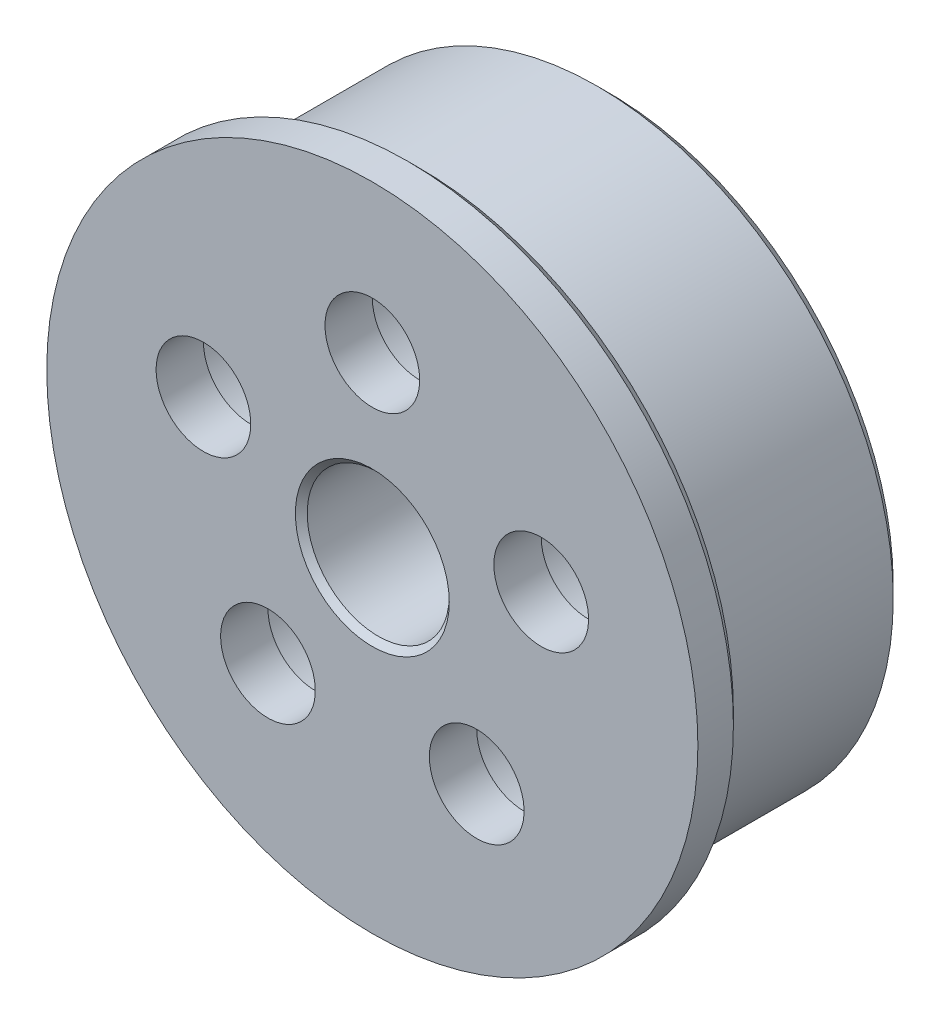
ISO-10303-21;
HEADER;
FILE_DESCRIPTION(('STEP AP214'),'2;1');
FILE_NAME('part.step','',(''),(''),'','','');
FILE_SCHEMA(('AUTOMOTIVE_DESIGN { 1 0 10303 214 1 1 1 1 }'));
ENDSEC;
DATA;
#1=APPLICATION_CONTEXT('core data for automotive mechanical design processes');
#2=APPLICATION_PROTOCOL_DEFINITION('international standard','automotive_design',2000,#1);
#3=PRODUCT_CONTEXT('',#1,'mechanical');
#4=PRODUCT('Part','Part','',(#3));
#5=PRODUCT_RELATED_PRODUCT_CATEGORY('part','',(#4));
#6=PRODUCT_DEFINITION_FORMATION('','',#4);
#7=PRODUCT_DEFINITION_CONTEXT('part definition',#1,'design');
#8=PRODUCT_DEFINITION('design','',#6,#7);
#9=PRODUCT_DEFINITION_SHAPE('','',#8);
#10=(LENGTH_UNIT() NAMED_UNIT(*) SI_UNIT(.MILLI.,.METRE.));
#11=(NAMED_UNIT(*) PLANE_ANGLE_UNIT() SI_UNIT($,.RADIAN.));
#12=(NAMED_UNIT(*) SI_UNIT($,.STERADIAN.) SOLID_ANGLE_UNIT());
#13=UNCERTAINTY_MEASURE_WITH_UNIT(LENGTH_MEASURE(1.E-05),#10,'distance_accuracy_value','');
#14=(GEOMETRIC_REPRESENTATION_CONTEXT(3) GLOBAL_UNCERTAINTY_ASSIGNED_CONTEXT((#13)) GLOBAL_UNIT_ASSIGNED_CONTEXT((#10,
#11,#12)) REPRESENTATION_CONTEXT('',''));
#15=CARTESIAN_POINT('',(0.,0.,0.));
#16=DIRECTION('',(0.,0.,1.));
#17=DIRECTION('',(1.,0.,0.));
#18=AXIS2_PLACEMENT_3D('',#15,#16,#17);
#19=CARTESIAN_POINT('',(0.,0.,10.));
#20=DIRECTION('',(0.,0.,-1.));
#21=DIRECTION('',(-1.,0.,0.));
#22=AXIS2_PLACEMENT_3D('',#19,#20,#21);
#23=CYLINDRICAL_SURFACE('',#22,12.5);
#24=CARTESIAN_POINT('',(0.,0.,0.500000000000002));
#25=DIRECTION('',(0.,0.,1.));
#26=DIRECTION('',(1.,0.,0.));
#27=AXIS2_PLACEMENT_3D('',#24,#25,#26);
#28=CIRCLE('',#27,12.5);
#29=CARTESIAN_POINT('',(12.5,0.,0.500000000000002));
#30=VERTEX_POINT('',#29);
#31=EDGE_CURVE('E100',#30,#30,#28,.T.);
#32=ORIENTED_EDGE('',*,*,#31,.T.);
#33=EDGE_LOOP('',(#32));
#34=FACE_BOUND('',#33,.T.);
#35=CARTESIAN_POINT('',(0.,0.,8.));
#36=DIRECTION('',(0.,0.,1.));
#37=DIRECTION('',(1.,0.,0.));
#38=AXIS2_PLACEMENT_3D('',#35,#36,#37);
#39=CIRCLE('',#38,12.5);
#40=CARTESIAN_POINT('',(12.5,0.,8.));
#41=VERTEX_POINT('',#40);
#42=EDGE_CURVE('E103',#41,#41,#39,.T.);
#43=ORIENTED_EDGE('',*,*,#42,.F.);
#44=EDGE_LOOP('',(#43));
#45=FACE_BOUND('',#44,.T.);
#46=ADVANCED_FACE('F40',(#34,#45),#23,.T.);
#47=CARTESIAN_POINT('',(0.,0.,10.));
#48=DIRECTION('',(0.,0.,1.));
#49=DIRECTION('',(1.,0.,0.));
#50=AXIS2_PLACEMENT_3D('',#47,#48,#49);
#51=PLANE('',#50);
#52=CARTESIAN_POINT('',(0.,0.,10.));
#53=DIRECTION('',(0.,0.,1.));
#54=DIRECTION('',(1.,0.,0.));
#55=AXIS2_PLACEMENT_3D('',#52,#53,#54);
#56=CIRCLE('',#55,3.25);
#57=CARTESIAN_POINT('',(3.25,0.,10.));
#58=VERTEX_POINT('',#57);
#59=EDGE_CURVE('E64',#58,#58,#56,.F.);
#60=ORIENTED_EDGE('',*,*,#59,.T.);
#61=EDGE_LOOP('',(#60));
#62=FACE_BOUND('',#61,.T.);
#63=CARTESIAN_POINT('',(0.,7.5,10.));
#64=DIRECTION('',(0.,0.,-1.));
#65=DIRECTION('',(-1.,0.,0.));
#66=AXIS2_PLACEMENT_3D('',#63,#64,#65);
#67=CIRCLE('',#66,2.);
#68=CARTESIAN_POINT('',(-2.,7.5,10.));
#69=VERTEX_POINT('',#68);
#70=EDGE_CURVE('E145',#69,#69,#67,.T.);
#71=ORIENTED_EDGE('',*,*,#70,.T.);
#72=EDGE_LOOP('',(#71));
#73=FACE_BOUND('',#72,.T.);
#74=CARTESIAN_POINT('',(-7.13292387221365,2.3176274578121,10.));
#75=DIRECTION('',(0.,0.,-1.));
#76=DIRECTION('',(-1.,0.,0.));
#77=AXIS2_PLACEMENT_3D('',#74,#75,#76);
#78=CIRCLE('',#77,2.);
#79=CARTESIAN_POINT('',(-9.13292387221365,2.3176274578121,10.));
#80=VERTEX_POINT('',#79);
#81=EDGE_CURVE('E136',#80,#80,#78,.T.);
#82=ORIENTED_EDGE('',*,*,#81,.T.);
#83=EDGE_LOOP('',(#82));
#84=FACE_BOUND('',#83,.T.);
#85=CARTESIAN_POINT('',(-4.40838939219355,-6.06762745781211,10.));
#86=DIRECTION('',(0.,0.,-1.));
#87=DIRECTION('',(-1.,0.,0.));
#88=AXIS2_PLACEMENT_3D('',#85,#86,#87);
#89=CIRCLE('',#88,2.);
#90=CARTESIAN_POINT('',(-6.40838939219355,-6.06762745781211,10.));
#91=VERTEX_POINT('',#90);
#92=EDGE_CURVE('E127',#91,#91,#89,.T.);
#93=ORIENTED_EDGE('',*,*,#92,.T.);
#94=EDGE_LOOP('',(#93));
#95=FACE_BOUND('',#94,.T.);
#96=CARTESIAN_POINT('',(4.40838939219355,-6.0676274578121,10.));
#97=DIRECTION('',(0.,0.,-1.));
#98=DIRECTION('',(-1.,0.,0.));
#99=AXIS2_PLACEMENT_3D('',#96,#97,#98);
#100=CIRCLE('',#99,2.);
#101=CARTESIAN_POINT('',(2.40838939219355,-6.0676274578121,10.));
#102=VERTEX_POINT('',#101);
#103=EDGE_CURVE('E118',#102,#102,#100,.T.);
#104=ORIENTED_EDGE('',*,*,#103,.T.);
#105=EDGE_LOOP('',(#104));
#106=FACE_BOUND('',#105,.T.);
#107=CARTESIAN_POINT('',(7.13292387221365,2.31762745781211,10.));
#108=DIRECTION('',(0.,0.,-1.));
#109=DIRECTION('',(-1.,0.,0.));
#110=AXIS2_PLACEMENT_3D('',#107,#108,#109);
#111=CIRCLE('',#110,2.);
#112=CARTESIAN_POINT('',(5.13292387221365,2.31762745781211,10.));
#113=VERTEX_POINT('',#112);
#114=EDGE_CURVE('E109',#113,#113,#111,.T.);
#115=ORIENTED_EDGE('',*,*,#114,.T.);
#116=EDGE_LOOP('',(#115));
#117=FACE_BOUND('',#116,.T.);
#118=CARTESIAN_POINT('',(0.,0.,10.));
#119=DIRECTION('',(0.,0.,1.));
#120=DIRECTION('',(1.,0.,0.));
#121=AXIS2_PLACEMENT_3D('',#118,#119,#120);
#122=CIRCLE('',#121,13.75);
#123=CARTESIAN_POINT('',(13.75,0.,10.));
#124=VERTEX_POINT('',#123);
#125=EDGE_CURVE('E106',#124,#124,#122,.T.);
#126=ORIENTED_EDGE('',*,*,#125,.T.);
#127=EDGE_LOOP('',(#126));
#128=FACE_BOUND('',#127,.T.);
#129=ADVANCED_FACE('F172',(#62,#73,#84,#95,#106,#117,#128),#51,.T.);
#130=CARTESIAN_POINT('',(0.,0.,0.));
#131=DIRECTION('',(0.,0.,1.));
#132=DIRECTION('',(1.,0.,0.));
#133=AXIS2_PLACEMENT_3D('',#130,#131,#132);
#134=PLANE('',#133);
#135=CARTESIAN_POINT('',(0.,0.,0.));
#136=DIRECTION('',(0.,0.,1.));
#137=DIRECTION('',(1.,0.,0.));
#138=AXIS2_PLACEMENT_3D('',#135,#136,#137);
#139=CIRCLE('',#138,3.25);
#140=CARTESIAN_POINT('',(3.25,0.,0.));
#141=VERTEX_POINT('',#140);
#142=EDGE_CURVE('E67',#141,#141,#139,.T.);
#143=ORIENTED_EDGE('',*,*,#142,.T.);
#144=EDGE_LOOP('',(#143));
#145=FACE_BOUND('',#144,.T.);
#146=CARTESIAN_POINT('',(4.40838939219355,-6.0676274578121,0.));
#147=DIRECTION('',(0.,0.,1.));
#148=DIRECTION('',(1.,0.,0.));
#149=AXIS2_PLACEMENT_3D('',#146,#147,#148);
#150=CIRCLE('',#149,3.75);
#151=CARTESIAN_POINT('',(8.15838939219355,-6.0676274578121,0.));
#152=VERTEX_POINT('',#151);
#153=EDGE_CURVE('E70',#152,#152,#150,.T.);
#154=ORIENTED_EDGE('',*,*,#153,.T.);
#155=EDGE_LOOP('',(#154));
#156=FACE_BOUND('',#155,.T.);
#157=CARTESIAN_POINT('',(-4.40838939219355,-6.06762745781211,0.));
#158=DIRECTION('',(0.,0.,1.));
#159=DIRECTION('',(1.,0.,0.));
#160=AXIS2_PLACEMENT_3D('',#157,#158,#159);
#161=CIRCLE('',#160,3.75);
#162=CARTESIAN_POINT('',(-0.658389392193544,-6.06762745781211,0.));
#163=VERTEX_POINT('',#162);
#164=EDGE_CURVE('E73',#163,#163,#161,.T.);
#165=ORIENTED_EDGE('',*,*,#164,.T.);
#166=EDGE_LOOP('',(#165));
#167=FACE_BOUND('',#166,.T.);
#168=CARTESIAN_POINT('',(-7.13292387221365,2.3176274578121,0.));
#169=DIRECTION('',(0.,0.,1.));
#170=DIRECTION('',(1.,0.,0.));
#171=AXIS2_PLACEMENT_3D('',#168,#169,#170);
#172=CIRCLE('',#171,3.75);
#173=CARTESIAN_POINT('',(-3.38292387221365,2.3176274578121,0.));
#174=VERTEX_POINT('',#173);
#175=EDGE_CURVE('E76',#174,#174,#172,.T.);
#176=ORIENTED_EDGE('',*,*,#175,.T.);
#177=EDGE_LOOP('',(#176));
#178=FACE_BOUND('',#177,.T.);
#179=CARTESIAN_POINT('',(0.,7.5,0.));
#180=DIRECTION('',(0.,0.,1.));
#181=DIRECTION('',(1.,0.,0.));
#182=AXIS2_PLACEMENT_3D('',#179,#180,#181);
#183=CIRCLE('',#182,3.75);
#184=CARTESIAN_POINT('',(3.75,7.5,0.));
#185=VERTEX_POINT('',#184);
#186=EDGE_CURVE('E79',#185,#185,#183,.T.);
#187=ORIENTED_EDGE('',*,*,#186,.T.);
#188=EDGE_LOOP('',(#187));
#189=FACE_BOUND('',#188,.T.);
#190=CARTESIAN_POINT('',(7.13292387221365,2.31762745781211,0.));
#191=DIRECTION('',(0.,0.,1.));
#192=DIRECTION('',(1.,0.,0.));
#193=AXIS2_PLACEMENT_3D('',#190,#191,#192);
#194=CIRCLE('',#193,3.75);
#195=CARTESIAN_POINT('',(10.8829238722137,2.31762745781211,0.));
#196=VERTEX_POINT('',#195);
#197=EDGE_CURVE('E82',#196,#196,#194,.T.);
#198=ORIENTED_EDGE('',*,*,#197,.T.);
#199=EDGE_LOOP('',(#198));
#200=FACE_BOUND('',#199,.T.);
#201=CARTESIAN_POINT('',(0.,0.,0.));
#202=DIRECTION('',(0.,0.,1.));
#203=DIRECTION('',(1.,0.,0.));
#204=AXIS2_PLACEMENT_3D('',#201,#202,#203);
#205=CIRCLE('',#204,12.);
#206=CARTESIAN_POINT('',(12.,0.,0.));
#207=VERTEX_POINT('',#206);
#208=EDGE_CURVE('E97',#207,#207,#205,.F.);
#209=ORIENTED_EDGE('',*,*,#208,.T.);
#210=EDGE_LOOP('',(#209));
#211=FACE_BOUND('',#210,.T.);
#212=ADVANCED_FACE('F178',(#145,#156,#167,#178,#189,#200,#211),#134,.F.);
#213=CARTESIAN_POINT('',(0.,0.,8.));
#214=DIRECTION('',(0.,0.,1.));
#215=DIRECTION('',(1.,0.,0.));
#216=AXIS2_PLACEMENT_3D('',#213,#214,#215);
#217=CYLINDRICAL_SURFACE('',#216,13.75);
#218=CARTESIAN_POINT('',(0.,0.,8.5));
#219=DIRECTION('',(0.,0.,1.));
#220=DIRECTION('',(1.,0.,0.));
#221=AXIS2_PLACEMENT_3D('',#218,#219,#220);
#222=CIRCLE('',#221,13.75);
#223=CARTESIAN_POINT('',(13.75,0.,8.5));
#224=VERTEX_POINT('',#223);
#225=EDGE_CURVE('E94',#224,#224,#222,.T.);
#226=ORIENTED_EDGE('',*,*,#225,.T.);
#227=EDGE_LOOP('',(#226));
#228=FACE_BOUND('',#227,.T.);
#229=ORIENTED_EDGE('',*,*,#125,.F.);
#230=EDGE_LOOP('',(#229));
#231=FACE_BOUND('',#230,.T.);
#232=ADVANCED_FACE('F242',(#228,#231),#217,.T.);
#233=CARTESIAN_POINT('',(0.,0.,8.));
#234=DIRECTION('',(0.,0.,1.));
#235=DIRECTION('',(1.,0.,0.));
#236=AXIS2_PLACEMENT_3D('',#233,#234,#235);
#237=PLANE('',#236);
#238=CARTESIAN_POINT('',(0.,0.,8.));
#239=DIRECTION('',(0.,0.,1.));
#240=DIRECTION('',(1.,0.,0.));
#241=AXIS2_PLACEMENT_3D('',#238,#239,#240);
#242=CIRCLE('',#241,13.25);
#243=CARTESIAN_POINT('',(13.25,0.,8.));
#244=VERTEX_POINT('',#243);
#245=EDGE_CURVE('E91',#244,#244,#242,.F.);
#246=ORIENTED_EDGE('',*,*,#245,.T.);
#247=EDGE_LOOP('',(#246));
#248=FACE_BOUND('',#247,.T.);
#249=ORIENTED_EDGE('',*,*,#42,.T.);
#250=EDGE_LOOP('',(#249));
#251=FACE_BOUND('',#250,.T.);
#252=ADVANCED_FACE('F253',(#248,#251),#237,.F.);
#253=CARTESIAN_POINT('',(0.,0.,10.));
#254=DIRECTION('',(0.,0.,-1.));
#255=DIRECTION('',(-1.,0.,0.));
#256=AXIS2_PLACEMENT_3D('',#253,#254,#255);
#257=CYLINDRICAL_SURFACE('',#256,3.);
#258=CARTESIAN_POINT('',(0.,0.,0.249999999999995));
#259=DIRECTION('',(0.,0.,1.));
#260=DIRECTION('',(1.,0.,0.));
#261=AXIS2_PLACEMENT_3D('',#258,#259,#260);
#262=CIRCLE('',#261,3.);
#263=CARTESIAN_POINT('',(3.,0.,0.249999999999995));
#264=VERTEX_POINT('',#263);
#265=EDGE_CURVE('E85',#264,#264,#262,.F.);
#266=ORIENTED_EDGE('',*,*,#265,.T.);
#267=EDGE_LOOP('',(#266));
#268=FACE_BOUND('',#267,.T.);
#269=CARTESIAN_POINT('',(0.,0.,9.75));
#270=DIRECTION('',(0.,0.,1.));
#271=DIRECTION('',(1.,0.,0.));
#272=AXIS2_PLACEMENT_3D('',#269,#270,#271);
#273=CIRCLE('',#272,3.);
#274=CARTESIAN_POINT('',(3.,0.,9.75));
#275=VERTEX_POINT('',#274);
#276=EDGE_CURVE('E88',#275,#275,#273,.T.);
#277=ORIENTED_EDGE('',*,*,#276,.T.);
#278=EDGE_LOOP('',(#277));
#279=FACE_BOUND('',#278,.T.);
#280=ADVANCED_FACE('F319',(#268,#279),#257,.F.);
#281=CARTESIAN_POINT('',(7.13292387221365,2.31762745781211,0.));
#282=DIRECTION('',(0.,0.,-1.));
#283=DIRECTION('',(-1.,0.,0.));
#284=AXIS2_PLACEMENT_3D('',#281,#282,#283);
#285=CYLINDRICAL_SURFACE('',#284,2.);
#286=ORIENTED_EDGE('',*,*,#114,.F.);
#287=EDGE_LOOP('',(#286));
#288=FACE_BOUND('',#287,.T.);
#289=CARTESIAN_POINT('',(7.13292387221365,2.31762745781211,8.));
#290=DIRECTION('',(0.,0.,-1.));
#291=DIRECTION('',(-1.,0.,0.));
#292=AXIS2_PLACEMENT_3D('',#289,#290,#291);
#293=CIRCLE('',#292,2.);
#294=CARTESIAN_POINT('',(5.13292387221365,2.31762745781211,8.));
#295=VERTEX_POINT('',#294);
#296=EDGE_CURVE('E112',#295,#295,#293,.T.);
#297=ORIENTED_EDGE('',*,*,#296,.T.);
#298=EDGE_LOOP('',(#297));
#299=FACE_BOUND('',#298,.T.);
#300=ADVANCED_FACE('F315',(#288,#299),#285,.F.);
#301=CARTESIAN_POINT('',(9.13292387221365,2.31762745781211,8.));
#302=DIRECTION('',(0.,0.,1.));
#303=DIRECTION('',(1.,0.,0.));
#304=AXIS2_PLACEMENT_3D('',#301,#302,#303);
#305=PLANE('',#304);
#306=ORIENTED_EDGE('',*,*,#296,.F.);
#307=EDGE_LOOP('',(#306));
#308=FACE_BOUND('',#307,.T.);
#309=CARTESIAN_POINT('',(7.13292387221365,2.31762745781211,8.));
#310=DIRECTION('',(0.,0.,-1.));
#311=DIRECTION('',(-1.,0.,0.));
#312=AXIS2_PLACEMENT_3D('',#309,#310,#311);
#313=CIRCLE('',#312,3.5);
#314=CARTESIAN_POINT('',(3.63292387221365,2.31762745781211,8.));
#315=VERTEX_POINT('',#314);
#316=EDGE_CURVE('E115',#315,#315,#313,.T.);
#317=ORIENTED_EDGE('',*,*,#316,.T.);
#318=EDGE_LOOP('',(#317));
#319=FACE_BOUND('',#318,.T.);
#320=ADVANCED_FACE('F312',(#308,#319),#305,.F.);
#321=CARTESIAN_POINT('',(7.13292387221365,2.31762745781211,0.));
#322=DIRECTION('',(0.,0.,-1.));
#323=DIRECTION('',(-1.,0.,0.));
#324=AXIS2_PLACEMENT_3D('',#321,#322,#323);
#325=CYLINDRICAL_SURFACE('',#324,3.5);
#326=CARTESIAN_POINT('',(7.13292387221365,2.31762745781211,0.250000000000002));
#327=DIRECTION('',(0.,0.,1.));
#328=DIRECTION('',(1.,0.,0.));
#329=AXIS2_PLACEMENT_3D('',#326,#327,#328);
#330=CIRCLE('',#329,3.5);
#331=CARTESIAN_POINT('',(10.6329238722137,2.31762745781211,0.250000000000002));
#332=VERTEX_POINT('',#331);
#333=EDGE_CURVE('E10',#332,#332,#330,.F.);
#334=ORIENTED_EDGE('',*,*,#333,.T.);
#335=EDGE_LOOP('',(#334));
#336=FACE_BOUND('',#335,.T.);
#337=ORIENTED_EDGE('',*,*,#316,.F.);
#338=EDGE_LOOP('',(#337));
#339=FACE_BOUND('',#338,.T.);
#340=ADVANCED_FACE('F308',(#336,#339),#325,.F.);
#341=CARTESIAN_POINT('',(4.40838939219355,-6.0676274578121,0.));
#342=DIRECTION('',(0.,0.,-1.));
#343=DIRECTION('',(-1.,0.,0.));
#344=AXIS2_PLACEMENT_3D('',#341,#342,#343);
#345=CYLINDRICAL_SURFACE('',#344,2.);
#346=ORIENTED_EDGE('',*,*,#103,.F.);
#347=EDGE_LOOP('',(#346));
#348=FACE_BOUND('',#347,.T.);
#349=CARTESIAN_POINT('',(4.40838939219355,-6.0676274578121,8.));
#350=DIRECTION('',(0.,0.,-1.));
#351=DIRECTION('',(-1.,0.,0.));
#352=AXIS2_PLACEMENT_3D('',#349,#350,#351);
#353=CIRCLE('',#352,2.);
#354=CARTESIAN_POINT('',(2.40838939219355,-6.0676274578121,8.));
#355=VERTEX_POINT('',#354);
#356=EDGE_CURVE('E121',#355,#355,#353,.T.);
#357=ORIENTED_EDGE('',*,*,#356,.T.);
#358=EDGE_LOOP('',(#357));
#359=FACE_BOUND('',#358,.T.);
#360=ADVANCED_FACE('F304',(#348,#359),#345,.F.);
#361=CARTESIAN_POINT('',(6.40838939219355,-6.0676274578121,8.));
#362=DIRECTION('',(0.,0.,1.));
#363=DIRECTION('',(1.,0.,0.));
#364=AXIS2_PLACEMENT_3D('',#361,#362,#363);
#365=PLANE('',#364);
#366=ORIENTED_EDGE('',*,*,#356,.F.);
#367=EDGE_LOOP('',(#366));
#368=FACE_BOUND('',#367,.T.);
#369=CARTESIAN_POINT('',(4.40838939219355,-6.0676274578121,8.));
#370=DIRECTION('',(0.,0.,-1.));
#371=DIRECTION('',(-1.,0.,0.));
#372=AXIS2_PLACEMENT_3D('',#369,#370,#371);
#373=CIRCLE('',#372,3.5);
#374=CARTESIAN_POINT('',(0.908389392193551,-6.0676274578121,8.));
#375=VERTEX_POINT('',#374);
#376=EDGE_CURVE('E124',#375,#375,#373,.T.);
#377=ORIENTED_EDGE('',*,*,#376,.T.);
#378=EDGE_LOOP('',(#377));
#379=FACE_BOUND('',#378,.T.);
#380=ADVANCED_FACE('F300',(#368,#379),#365,.F.);
#381=CARTESIAN_POINT('',(4.40838939219355,-6.0676274578121,0.));
#382=DIRECTION('',(0.,0.,-1.));
#383=DIRECTION('',(-1.,0.,0.));
#384=AXIS2_PLACEMENT_3D('',#381,#382,#383);
#385=CYLINDRICAL_SURFACE('',#384,3.5);
#386=CARTESIAN_POINT('',(4.40838939219355,-6.0676274578121,0.25));
#387=DIRECTION('',(0.,0.,1.));
#388=DIRECTION('',(1.,0.,0.));
#389=AXIS2_PLACEMENT_3D('',#386,#387,#388);
#390=CIRCLE('',#389,3.5);
#391=CARTESIAN_POINT('',(7.90838939219355,-6.0676274578121,0.25));
#392=VERTEX_POINT('',#391);
#393=EDGE_CURVE('E61',#392,#392,#390,.F.);
#394=ORIENTED_EDGE('',*,*,#393,.T.);
#395=EDGE_LOOP('',(#394));
#396=FACE_BOUND('',#395,.T.);
#397=ORIENTED_EDGE('',*,*,#376,.F.);
#398=EDGE_LOOP('',(#397));
#399=FACE_BOUND('',#398,.T.);
#400=ADVANCED_FACE('F296',(#396,#399),#385,.F.);
#401=CARTESIAN_POINT('',(-4.40838939219355,-6.06762745781211,0.));
#402=DIRECTION('',(0.,0.,-1.));
#403=DIRECTION('',(-1.,0.,0.));
#404=AXIS2_PLACEMENT_3D('',#401,#402,#403);
#405=CYLINDRICAL_SURFACE('',#404,2.);
#406=ORIENTED_EDGE('',*,*,#92,.F.);
#407=EDGE_LOOP('',(#406));
#408=FACE_BOUND('',#407,.T.);
#409=CARTESIAN_POINT('',(-4.40838939219355,-6.06762745781211,8.));
#410=DIRECTION('',(0.,0.,-1.));
#411=DIRECTION('',(-1.,0.,0.));
#412=AXIS2_PLACEMENT_3D('',#409,#410,#411);
#413=CIRCLE('',#412,2.);
#414=CARTESIAN_POINT('',(-6.40838939219355,-6.06762745781211,8.));
#415=VERTEX_POINT('',#414);
#416=EDGE_CURVE('E130',#415,#415,#413,.T.);
#417=ORIENTED_EDGE('',*,*,#416,.T.);
#418=EDGE_LOOP('',(#417));
#419=FACE_BOUND('',#418,.T.);
#420=ADVANCED_FACE('F292',(#408,#419),#405,.F.);
#421=CARTESIAN_POINT('',(-2.40838939219355,-6.06762745781211,8.));
#422=DIRECTION('',(0.,0.,1.));
#423=DIRECTION('',(1.,0.,0.));
#424=AXIS2_PLACEMENT_3D('',#421,#422,#423);
#425=PLANE('',#424);
#426=ORIENTED_EDGE('',*,*,#416,.F.);
#427=EDGE_LOOP('',(#426));
#428=FACE_BOUND('',#427,.T.);
#429=CARTESIAN_POINT('',(-4.40838939219355,-6.06762745781211,8.));
#430=DIRECTION('',(0.,0.,-1.));
#431=DIRECTION('',(-1.,0.,0.));
#432=AXIS2_PLACEMENT_3D('',#429,#430,#431);
#433=CIRCLE('',#432,3.5);
#434=CARTESIAN_POINT('',(-7.90838939219355,-6.06762745781211,8.));
#435=VERTEX_POINT('',#434);
#436=EDGE_CURVE('E133',#435,#435,#433,.T.);
#437=ORIENTED_EDGE('',*,*,#436,.T.);
#438=EDGE_LOOP('',(#437));
#439=FACE_BOUND('',#438,.T.);
#440=ADVANCED_FACE('F288',(#428,#439),#425,.F.);
#441=CARTESIAN_POINT('',(-4.40838939219355,-6.06762745781211,0.));
#442=DIRECTION('',(0.,0.,-1.));
#443=DIRECTION('',(-1.,0.,0.));
#444=AXIS2_PLACEMENT_3D('',#441,#442,#443);
#445=CYLINDRICAL_SURFACE('',#444,3.5);
#446=CARTESIAN_POINT('',(-4.40838939219355,-6.06762745781211,0.250000000000002));
#447=DIRECTION('',(0.,0.,1.));
#448=DIRECTION('',(1.,0.,0.));
#449=AXIS2_PLACEMENT_3D('',#446,#447,#448);
#450=CIRCLE('',#449,3.5);
#451=CARTESIAN_POINT('',(-0.908389392193548,-6.06762745781211,0.250000000000002));
#452=VERTEX_POINT('',#451);
#453=EDGE_CURVE('E56',#452,#452,#450,.F.);
#454=ORIENTED_EDGE('',*,*,#453,.T.);
#455=EDGE_LOOP('',(#454));
#456=FACE_BOUND('',#455,.T.);
#457=ORIENTED_EDGE('',*,*,#436,.F.);
#458=EDGE_LOOP('',(#457));
#459=FACE_BOUND('',#458,.T.);
#460=ADVANCED_FACE('F280',(#456,#459),#445,.F.);
#461=CARTESIAN_POINT('',(-7.13292387221365,2.3176274578121,0.));
#462=DIRECTION('',(0.,0.,-1.));
#463=DIRECTION('',(-1.,0.,0.));
#464=AXIS2_PLACEMENT_3D('',#461,#462,#463);
#465=CYLINDRICAL_SURFACE('',#464,2.);
#466=ORIENTED_EDGE('',*,*,#81,.F.);
#467=EDGE_LOOP('',(#466));
#468=FACE_BOUND('',#467,.T.);
#469=CARTESIAN_POINT('',(-7.13292387221365,2.3176274578121,8.));
#470=DIRECTION('',(0.,0.,-1.));
#471=DIRECTION('',(-1.,0.,0.));
#472=AXIS2_PLACEMENT_3D('',#469,#470,#471);
#473=CIRCLE('',#472,2.);
#474=CARTESIAN_POINT('',(-9.13292387221365,2.3176274578121,8.));
#475=VERTEX_POINT('',#474);
#476=EDGE_CURVE('E139',#475,#475,#473,.T.);
#477=ORIENTED_EDGE('',*,*,#476,.T.);
#478=EDGE_LOOP('',(#477));
#479=FACE_BOUND('',#478,.T.);
#480=ADVANCED_FACE('F274',(#468,#479),#465,.F.);
#481=CARTESIAN_POINT('',(-5.13292387221365,2.3176274578121,8.));
#482=DIRECTION('',(0.,0.,1.));
#483=DIRECTION('',(1.,0.,0.));
#484=AXIS2_PLACEMENT_3D('',#481,#482,#483);
#485=PLANE('',#484);
#486=ORIENTED_EDGE('',*,*,#476,.F.);
#487=EDGE_LOOP('',(#486));
#488=FACE_BOUND('',#487,.T.);
#489=CARTESIAN_POINT('',(-7.13292387221365,2.3176274578121,8.));
#490=DIRECTION('',(0.,0.,-1.));
#491=DIRECTION('',(-1.,0.,0.));
#492=AXIS2_PLACEMENT_3D('',#489,#490,#491);
#493=CIRCLE('',#492,3.5);
#494=CARTESIAN_POINT('',(-10.6329238722137,2.3176274578121,8.));
#495=VERTEX_POINT('',#494);
#496=EDGE_CURVE('E142',#495,#495,#493,.T.);
#497=ORIENTED_EDGE('',*,*,#496,.T.);
#498=EDGE_LOOP('',(#497));
#499=FACE_BOUND('',#498,.T.);
#500=ADVANCED_FACE('F269',(#488,#499),#485,.F.);
#501=CARTESIAN_POINT('',(-7.13292387221365,2.3176274578121,0.));
#502=DIRECTION('',(0.,0.,-1.));
#503=DIRECTION('',(-1.,0.,0.));
#504=AXIS2_PLACEMENT_3D('',#501,#502,#503);
#505=CYLINDRICAL_SURFACE('',#504,3.5);
#506=CARTESIAN_POINT('',(-7.13292387221365,2.3176274578121,0.250000000000002));
#507=DIRECTION('',(0.,0.,1.));
#508=DIRECTION('',(1.,0.,0.));
#509=AXIS2_PLACEMENT_3D('',#506,#507,#508);
#510=CIRCLE('',#509,3.5);
#511=CARTESIAN_POINT('',(-3.63292387221365,2.3176274578121,0.250000000000002));
#512=VERTEX_POINT('',#511);
#513=EDGE_CURVE('E52',#512,#512,#510,.F.);
#514=ORIENTED_EDGE('',*,*,#513,.T.);
#515=EDGE_LOOP('',(#514));
#516=FACE_BOUND('',#515,.T.);
#517=ORIENTED_EDGE('',*,*,#496,.F.);
#518=EDGE_LOOP('',(#517));
#519=FACE_BOUND('',#518,.T.);
#520=ADVANCED_FACE('F266',(#516,#519),#505,.F.);
#521=CARTESIAN_POINT('',(0.,7.5,0.));
#522=DIRECTION('',(0.,0.,-1.));
#523=DIRECTION('',(-1.,0.,0.));
#524=AXIS2_PLACEMENT_3D('',#521,#522,#523);
#525=CYLINDRICAL_SURFACE('',#524,2.);
#526=ORIENTED_EDGE('',*,*,#70,.F.);
#527=EDGE_LOOP('',(#526));
#528=FACE_BOUND('',#527,.T.);
#529=CARTESIAN_POINT('',(0.,7.5,8.));
#530=DIRECTION('',(0.,0.,-1.));
#531=DIRECTION('',(-1.,0.,0.));
#532=AXIS2_PLACEMENT_3D('',#529,#530,#531);
#533=CIRCLE('',#532,2.);
#534=CARTESIAN_POINT('',(-2.,7.5,8.));
#535=VERTEX_POINT('',#534);
#536=EDGE_CURVE('E148',#535,#535,#533,.T.);
#537=ORIENTED_EDGE('',*,*,#536,.T.);
#538=EDGE_LOOP('',(#537));
#539=FACE_BOUND('',#538,.T.);
#540=ADVANCED_FACE('F168',(#528,#539),#525,.F.);
#541=CARTESIAN_POINT('',(2.,7.5,8.));
#542=DIRECTION('',(0.,0.,1.));
#543=DIRECTION('',(1.,0.,0.));
#544=AXIS2_PLACEMENT_3D('',#541,#542,#543);
#545=PLANE('',#544);
#546=ORIENTED_EDGE('',*,*,#536,.F.);
#547=EDGE_LOOP('',(#546));
#548=FACE_BOUND('',#547,.T.);
#549=CARTESIAN_POINT('',(0.,7.5,8.));
#550=DIRECTION('',(0.,0.,-1.));
#551=DIRECTION('',(-1.,0.,0.));
#552=AXIS2_PLACEMENT_3D('',#549,#550,#551);
#553=CIRCLE('',#552,3.5);
#554=CARTESIAN_POINT('',(-3.5,7.5,8.));
#555=VERTEX_POINT('',#554);
#556=EDGE_CURVE('E151',#555,#555,#553,.T.);
#557=ORIENTED_EDGE('',*,*,#556,.T.);
#558=EDGE_LOOP('',(#557));
#559=FACE_BOUND('',#558,.T.);
#560=ADVANCED_FACE('F155',(#548,#559),#545,.F.);
#561=CARTESIAN_POINT('',(0.,7.5,0.));
#562=DIRECTION('',(0.,0.,-1.));
#563=DIRECTION('',(-1.,0.,0.));
#564=AXIS2_PLACEMENT_3D('',#561,#562,#563);
#565=CYLINDRICAL_SURFACE('',#564,3.5);
#566=CARTESIAN_POINT('',(0.,7.5,0.250000000000002));
#567=DIRECTION('',(0.,0.,1.));
#568=DIRECTION('',(1.,0.,0.));
#569=AXIS2_PLACEMENT_3D('',#566,#567,#568);
#570=CIRCLE('',#569,3.5);
#571=CARTESIAN_POINT('',(3.5,7.5,0.250000000000002));
#572=VERTEX_POINT('',#571);
#573=EDGE_CURVE('E48',#572,#572,#570,.F.);
#574=ORIENTED_EDGE('',*,*,#573,.T.);
#575=EDGE_LOOP('',(#574));
#576=FACE_BOUND('',#575,.T.);
#577=ORIENTED_EDGE('',*,*,#556,.F.);
#578=EDGE_LOOP('',(#577));
#579=FACE_BOUND('',#578,.T.);
#580=ADVANCED_FACE('F157',(#576,#579),#565,.F.);
#581=CARTESIAN_POINT('',(0.,0.,0.500000000000002));
#582=DIRECTION('',(0.,0.,1.));
#583=DIRECTION('',(1.,0.,0.));
#584=AXIS2_PLACEMENT_3D('',#581,#582,#583);
#585=CONICAL_SURFACE('',#584,12.5,0.785398163397453);
#586=ORIENTED_EDGE('',*,*,#208,.F.);
#587=EDGE_LOOP('',(#586));
#588=FACE_BOUND('',#587,.T.);
#589=ORIENTED_EDGE('',*,*,#31,.F.);
#590=EDGE_LOOP('',(#589));
#591=FACE_BOUND('',#590,.T.);
#592=ADVANCED_FACE('F159',(#588,#591),#585,.T.);
#593=CARTESIAN_POINT('',(0.,0.,8.5));
#594=DIRECTION('',(0.,0.,1.));
#595=DIRECTION('',(1.,0.,0.));
#596=AXIS2_PLACEMENT_3D('',#593,#594,#595);
#597=CONICAL_SURFACE('',#596,13.75,0.785398163397452);
#598=ORIENTED_EDGE('',*,*,#245,.F.);
#599=EDGE_LOOP('',(#598));
#600=FACE_BOUND('',#599,.T.);
#601=ORIENTED_EDGE('',*,*,#225,.F.);
#602=EDGE_LOOP('',(#601));
#603=FACE_BOUND('',#602,.T.);
#604=ADVANCED_FACE('F165',(#600,#603),#597,.T.);
#605=CARTESIAN_POINT('',(0.,0.,0.249999999999995));
#606=DIRECTION('',(0.,0.,-1.));
#607=DIRECTION('',(-1.,0.,0.));
#608=AXIS2_PLACEMENT_3D('',#605,#606,#607);
#609=CONICAL_SURFACE('',#608,3.,0.785398163397464);
#610=ORIENTED_EDGE('',*,*,#142,.F.);
#611=EDGE_LOOP('',(#610));
#612=FACE_BOUND('',#611,.T.);
#613=ORIENTED_EDGE('',*,*,#265,.F.);
#614=EDGE_LOOP('',(#613));
#615=FACE_BOUND('',#614,.T.);
#616=ADVANCED_FACE('F193',(#612,#615),#609,.F.);
#617=CARTESIAN_POINT('',(0.,0.,10.));
#618=DIRECTION('',(0.,0.,1.));
#619=DIRECTION('',(1.,0.,0.));
#620=AXIS2_PLACEMENT_3D('',#617,#618,#619);
#621=CONICAL_SURFACE('',#620,3.25,0.785398163397442);
#622=ORIENTED_EDGE('',*,*,#276,.F.);
#623=EDGE_LOOP('',(#622));
#624=FACE_BOUND('',#623,.T.);
#625=ORIENTED_EDGE('',*,*,#59,.F.);
#626=EDGE_LOOP('',(#625));
#627=FACE_BOUND('',#626,.T.);
#628=ADVANCED_FACE('F200',(#624,#627),#621,.F.);
#629=CARTESIAN_POINT('',(4.40838939219355,-6.0676274578121,0.25));
#630=DIRECTION('',(0.,0.,-1.));
#631=DIRECTION('',(-1.,0.,0.));
#632=AXIS2_PLACEMENT_3D('',#629,#630,#631);
#633=CONICAL_SURFACE('',#632,3.5,0.785398163397454);
#634=ORIENTED_EDGE('',*,*,#153,.F.);
#635=EDGE_LOOP('',(#634));
#636=FACE_BOUND('',#635,.T.);
#637=ORIENTED_EDGE('',*,*,#393,.F.);
#638=EDGE_LOOP('',(#637));
#639=FACE_BOUND('',#638,.T.);
#640=ADVANCED_FACE('F207',(#636,#639),#633,.F.);
#641=CARTESIAN_POINT('',(-4.40838939219355,-6.06762745781211,0.250000000000002));
#642=DIRECTION('',(0.,0.,-1.));
#643=DIRECTION('',(-1.,0.,0.));
#644=AXIS2_PLACEMENT_3D('',#641,#642,#643);
#645=CONICAL_SURFACE('',#644,3.5,0.785398163397453);
#646=ORIENTED_EDGE('',*,*,#164,.F.);
#647=EDGE_LOOP('',(#646));
#648=FACE_BOUND('',#647,.T.);
#649=ORIENTED_EDGE('',*,*,#453,.F.);
#650=EDGE_LOOP('',(#649));
#651=FACE_BOUND('',#650,.T.);
#652=ADVANCED_FACE('F214',(#648,#651),#645,.F.);
#653=CARTESIAN_POINT('',(-7.13292387221365,2.3176274578121,0.250000000000002));
#654=DIRECTION('',(0.,0.,-1.));
#655=DIRECTION('',(-1.,0.,0.));
#656=AXIS2_PLACEMENT_3D('',#653,#654,#655);
#657=CONICAL_SURFACE('',#656,3.5,0.785398163397453);
#658=ORIENTED_EDGE('',*,*,#175,.F.);
#659=EDGE_LOOP('',(#658));
#660=FACE_BOUND('',#659,.T.);
#661=ORIENTED_EDGE('',*,*,#513,.F.);
#662=EDGE_LOOP('',(#661));
#663=FACE_BOUND('',#662,.T.);
#664=ADVANCED_FACE('F221',(#660,#663),#657,.F.);
#665=CARTESIAN_POINT('',(0.,7.5,0.250000000000002));
#666=DIRECTION('',(0.,0.,-1.));
#667=DIRECTION('',(-1.,0.,0.));
#668=AXIS2_PLACEMENT_3D('',#665,#666,#667);
#669=CONICAL_SURFACE('',#668,3.5,0.785398163397453);
#670=ORIENTED_EDGE('',*,*,#186,.F.);
#671=EDGE_LOOP('',(#670));
#672=FACE_BOUND('',#671,.T.);
#673=ORIENTED_EDGE('',*,*,#573,.F.);
#674=EDGE_LOOP('',(#673));
#675=FACE_BOUND('',#674,.T.);
#676=ADVANCED_FACE('F227',(#672,#675),#669,.F.);
#677=CARTESIAN_POINT('',(7.13292387221365,2.31762745781211,0.250000000000002));
#678=DIRECTION('',(0.,0.,-1.));
#679=DIRECTION('',(-1.,0.,0.));
#680=AXIS2_PLACEMENT_3D('',#677,#678,#679);
#681=CONICAL_SURFACE('',#680,3.5,0.78539816339745);
#682=ORIENTED_EDGE('',*,*,#197,.F.);
#683=EDGE_LOOP('',(#682));
#684=FACE_BOUND('',#683,.T.);
#685=ORIENTED_EDGE('',*,*,#333,.F.);
#686=EDGE_LOOP('',(#685));
#687=FACE_BOUND('',#686,.T.);
#688=ADVANCED_FACE('F43',(#684,#687),#681,.F.);
#689=CLOSED_SHELL('',(#46,#129,#212,#232,#252,#280,#300,#320,#340,#360,#380,#400,#420,#440,#460,
#480,#500,#520,#540,#560,#580,#592,#604,#616,#628,#640,#652,#664,#676,#688));
#690=MANIFOLD_SOLID_BREP('B2',#689);
#691=ADVANCED_BREP_SHAPE_REPRESENTATION('',(#18,#690),#14);
#692=SHAPE_DEFINITION_REPRESENTATION(#9,#691);
ENDSEC;
END-ISO-10303-21;
